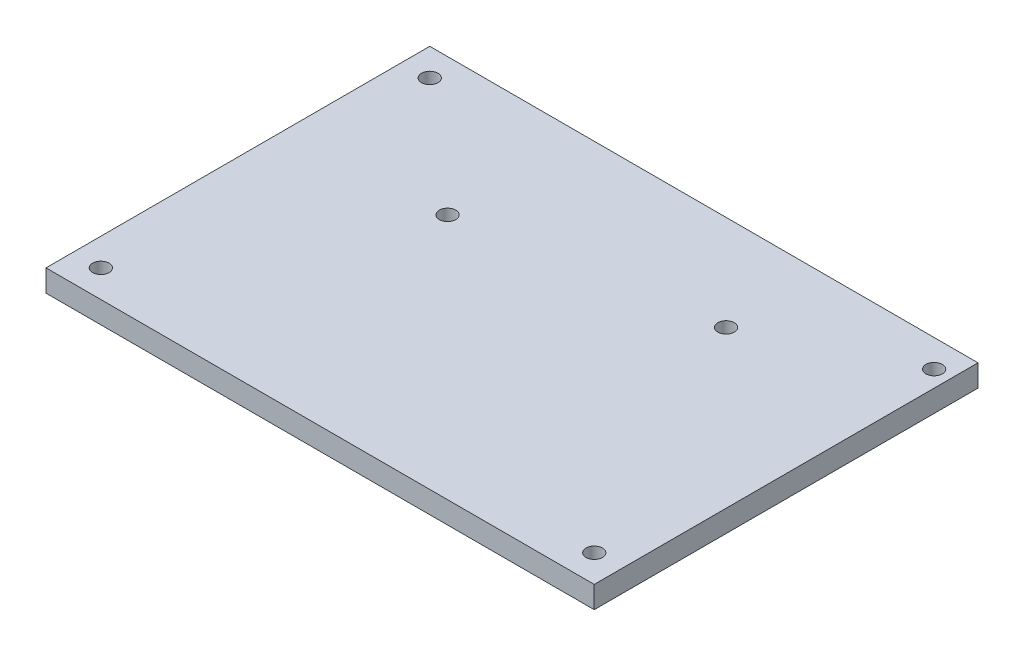
ISO-10303-21;
HEADER;
FILE_DESCRIPTION(('STEP AP214'),'2;1');
FILE_NAME('part.step','',(''),(''),'','','');
FILE_SCHEMA(('AUTOMOTIVE_DESIGN { 1 0 10303 214 1 1 1 1 }'));
ENDSEC;
DATA;
#1=APPLICATION_CONTEXT('core data for automotive mechanical design processes');
#2=APPLICATION_PROTOCOL_DEFINITION('international standard','automotive_design',2000,#1);
#3=PRODUCT_CONTEXT('',#1,'mechanical');
#4=PRODUCT('Part','Part','',(#3));
#5=PRODUCT_RELATED_PRODUCT_CATEGORY('part','',(#4));
#6=PRODUCT_DEFINITION_FORMATION('','',#4);
#7=PRODUCT_DEFINITION_CONTEXT('part definition',#1,'design');
#8=PRODUCT_DEFINITION('design','',#6,#7);
#9=PRODUCT_DEFINITION_SHAPE('','',#8);
#10=(LENGTH_UNIT() NAMED_UNIT(*) SI_UNIT(.MILLI.,.METRE.));
#11=(NAMED_UNIT(*) PLANE_ANGLE_UNIT() SI_UNIT($,.RADIAN.));
#12=(NAMED_UNIT(*) SI_UNIT($,.STERADIAN.) SOLID_ANGLE_UNIT());
#13=UNCERTAINTY_MEASURE_WITH_UNIT(LENGTH_MEASURE(1.E-05),#10,'distance_accuracy_value','');
#14=(GEOMETRIC_REPRESENTATION_CONTEXT(3) GLOBAL_UNCERTAINTY_ASSIGNED_CONTEXT((#13)) GLOBAL_UNIT_ASSIGNED_CONTEXT((#10,
#11,#12)) REPRESENTATION_CONTEXT('',''));
#15=CARTESIAN_POINT('',(0.,0.,0.));
#16=DIRECTION('',(0.,0.,1.));
#17=DIRECTION('',(1.,0.,0.));
#18=AXIS2_PLACEMENT_3D('',#15,#16,#17);
#19=CARTESIAN_POINT('',(0.,4.,0.));
#20=DIRECTION('',(1.,0.,0.));
#21=DIRECTION('',(0.,0.,-1.));
#22=AXIS2_PLACEMENT_3D('',#19,#20,#21);
#23=PLANE('',#22);
#24=DIRECTION('',(0.,0.,1.));
#25=VECTOR('',#24,1.);
#26=CARTESIAN_POINT('',(0.,0.,0.));
#27=LINE('',#26,#25);
#28=CARTESIAN_POINT('',(0.,0.,0.));
#29=VERTEX_POINT('',#28);
#30=CARTESIAN_POINT('',(0.,0.,70.));
#31=VERTEX_POINT('',#30);
#32=EDGE_CURVE('E98',#29,#31,#27,.T.);
#33=ORIENTED_EDGE('',*,*,#32,.T.);
#34=DIRECTION('',(0.,-1.,0.));
#35=VECTOR('',#34,1.);
#36=CARTESIAN_POINT('',(0.,4.,70.));
#37=LINE('',#36,#35);
#38=CARTESIAN_POINT('',(0.,4.,70.));
#39=VERTEX_POINT('',#38);
#40=EDGE_CURVE('E11',#39,#31,#37,.T.);
#41=ORIENTED_EDGE('',*,*,#40,.F.);
#42=DIRECTION('',(0.,0.,1.));
#43=VECTOR('',#42,1.);
#44=CARTESIAN_POINT('',(0.,4.,0.));
#45=LINE('',#44,#43);
#46=CARTESIAN_POINT('',(0.,4.,0.));
#47=VERTEX_POINT('',#46);
#48=EDGE_CURVE('E86',#47,#39,#45,.T.);
#49=ORIENTED_EDGE('',*,*,#48,.F.);
#50=DIRECTION('',(0.,-1.,0.));
#51=VECTOR('',#50,1.);
#52=CARTESIAN_POINT('',(0.,4.,0.));
#53=LINE('',#52,#51);
#54=EDGE_CURVE('E94',#47,#29,#53,.T.);
#55=ORIENTED_EDGE('',*,*,#54,.T.);
#56=EDGE_LOOP('',(#33,#41,#49,#55));
#57=FACE_BOUND('',#56,.T.);
#58=ADVANCED_FACE('F35',(#57),#23,.F.);
#59=CARTESIAN_POINT('',(0.,4.,70.));
#60=DIRECTION('',(0.,0.,-1.));
#61=DIRECTION('',(-1.,0.,0.));
#62=AXIS2_PLACEMENT_3D('',#59,#60,#61);
#63=PLANE('',#62);
#64=DIRECTION('',(1.,0.,0.));
#65=VECTOR('',#64,1.);
#66=CARTESIAN_POINT('',(0.,0.,70.));
#67=LINE('',#66,#65);
#68=CARTESIAN_POINT('',(100.,0.,70.));
#69=VERTEX_POINT('',#68);
#70=EDGE_CURVE('E90',#31,#69,#67,.T.);
#71=ORIENTED_EDGE('',*,*,#70,.T.);
#72=DIRECTION('',(0.,-1.,0.));
#73=VECTOR('',#72,1.);
#74=CARTESIAN_POINT('',(100.,4.,70.));
#75=LINE('',#74,#73);
#76=CARTESIAN_POINT('',(100.,4.,70.));
#77=VERTEX_POINT('',#76);
#78=EDGE_CURVE('E43',#77,#69,#75,.T.);
#79=ORIENTED_EDGE('',*,*,#78,.F.);
#80=DIRECTION('',(1.,0.,0.));
#81=VECTOR('',#80,1.);
#82=CARTESIAN_POINT('',(0.,4.,70.));
#83=LINE('',#82,#81);
#84=EDGE_CURVE('E81',#39,#77,#83,.T.);
#85=ORIENTED_EDGE('',*,*,#84,.F.);
#86=ORIENTED_EDGE('',*,*,#40,.T.);
#87=EDGE_LOOP('',(#71,#79,#85,#86));
#88=FACE_BOUND('',#87,.T.);
#89=ADVANCED_FACE('F89',(#88),#63,.F.);
#90=CARTESIAN_POINT('',(100.,4.,0.));
#91=DIRECTION('',(-1.,0.,0.));
#92=DIRECTION('',(0.,0.,1.));
#93=AXIS2_PLACEMENT_3D('',#90,#91,#92);
#94=PLANE('',#93);
#95=DIRECTION('',(0.,0.,-1.));
#96=VECTOR('',#95,1.);
#97=CARTESIAN_POINT('',(100.,0.,0.));
#98=LINE('',#97,#96);
#99=CARTESIAN_POINT('',(100.,0.,0.));
#100=VERTEX_POINT('',#99);
#101=EDGE_CURVE('E68',#69,#100,#98,.T.);
#102=ORIENTED_EDGE('',*,*,#101,.T.);
#103=DIRECTION('',(0.,-1.,0.));
#104=VECTOR('',#103,1.);
#105=CARTESIAN_POINT('',(100.,4.,0.));
#106=LINE('',#105,#104);
#107=CARTESIAN_POINT('',(100.,4.,0.));
#108=VERTEX_POINT('',#107);
#109=EDGE_CURVE('E91',#108,#100,#106,.T.);
#110=ORIENTED_EDGE('',*,*,#109,.F.);
#111=DIRECTION('',(0.,0.,-1.));
#112=VECTOR('',#111,1.);
#113=CARTESIAN_POINT('',(100.,4.,0.));
#114=LINE('',#113,#112);
#115=EDGE_CURVE('E84',#77,#108,#114,.T.);
#116=ORIENTED_EDGE('',*,*,#115,.F.);
#117=ORIENTED_EDGE('',*,*,#78,.T.);
#118=EDGE_LOOP('',(#102,#110,#116,#117));
#119=FACE_BOUND('',#118,.T.);
#120=ADVANCED_FACE('F92',(#119),#94,.F.);
#121=CARTESIAN_POINT('',(0.,4.,0.));
#122=DIRECTION('',(0.,0.,1.));
#123=DIRECTION('',(1.,0.,0.));
#124=AXIS2_PLACEMENT_3D('',#121,#122,#123);
#125=PLANE('',#124);
#126=DIRECTION('',(-1.,0.,0.));
#127=VECTOR('',#126,1.);
#128=CARTESIAN_POINT('',(0.,0.,0.));
#129=LINE('',#128,#127);
#130=EDGE_CURVE('E74',#100,#29,#129,.T.);
#131=ORIENTED_EDGE('',*,*,#130,.T.);
#132=ORIENTED_EDGE('',*,*,#54,.F.);
#133=DIRECTION('',(-1.,0.,0.));
#134=VECTOR('',#133,1.);
#135=CARTESIAN_POINT('',(0.,4.,0.));
#136=LINE('',#135,#134);
#137=EDGE_CURVE('E51',#108,#47,#136,.T.);
#138=ORIENTED_EDGE('',*,*,#137,.F.);
#139=ORIENTED_EDGE('',*,*,#109,.T.);
#140=EDGE_LOOP('',(#131,#132,#138,#139));
#141=FACE_BOUND('',#140,.T.);
#142=ADVANCED_FACE('F106',(#141),#125,.F.);
#143=CARTESIAN_POINT('',(0.,4.,0.));
#144=DIRECTION('',(0.,1.,0.));
#145=DIRECTION('',(0.,0.,1.));
#146=AXIS2_PLACEMENT_3D('',#143,#144,#145);
#147=PLANE('',#146);
#148=CARTESIAN_POINT('',(5.,4.,5.));
#149=DIRECTION('',(0.,1.,0.));
#150=DIRECTION('',(0.,0.,1.));
#151=AXIS2_PLACEMENT_3D('',#148,#149,#150);
#152=CIRCLE('',#151,1.5);
#153=CARTESIAN_POINT('',(5.,4.,6.5));
#154=VERTEX_POINT('',#153);
#155=EDGE_CURVE('E142',#154,#154,#152,.T.);
#156=ORIENTED_EDGE('',*,*,#155,.F.);
#157=EDGE_LOOP('',(#156));
#158=FACE_BOUND('',#157,.T.);
#159=CARTESIAN_POINT('',(97.,4.,5.));
#160=DIRECTION('',(0.,1.,0.));
#161=DIRECTION('',(0.,0.,1.));
#162=AXIS2_PLACEMENT_3D('',#159,#160,#161);
#163=CIRCLE('',#162,1.5);
#164=CARTESIAN_POINT('',(97.,4.,6.5));
#165=VERTEX_POINT('',#164);
#166=EDGE_CURVE('E136',#165,#165,#163,.T.);
#167=ORIENTED_EDGE('',*,*,#166,.F.);
#168=EDGE_LOOP('',(#167));
#169=FACE_BOUND('',#168,.T.);
#170=CARTESIAN_POINT('',(95.,4.,65.));
#171=DIRECTION('',(0.,1.,0.));
#172=DIRECTION('',(0.,0.,1.));
#173=AXIS2_PLACEMENT_3D('',#170,#171,#172);
#174=CIRCLE('',#173,1.5);
#175=CARTESIAN_POINT('',(95.,4.,66.5));
#176=VERTEX_POINT('',#175);
#177=EDGE_CURVE('E130',#176,#176,#174,.T.);
#178=ORIENTED_EDGE('',*,*,#177,.F.);
#179=EDGE_LOOP('',(#178));
#180=FACE_BOUND('',#179,.T.);
#181=CARTESIAN_POINT('',(5.,4.,65.));
#182=DIRECTION('',(0.,1.,0.));
#183=DIRECTION('',(0.,0.,1.));
#184=AXIS2_PLACEMENT_3D('',#181,#182,#183);
#185=CIRCLE('',#184,1.5);
#186=CARTESIAN_POINT('',(5.,4.,66.5));
#187=VERTEX_POINT('',#186);
#188=EDGE_CURVE('E124',#187,#187,#185,.T.);
#189=ORIENTED_EDGE('',*,*,#188,.F.);
#190=EDGE_LOOP('',(#189));
#191=FACE_BOUND('',#190,.T.);
#192=CARTESIAN_POINT('',(71.43,4.,17.38));
#193=DIRECTION('',(0.,1.,0.));
#194=DIRECTION('',(0.,0.,1.));
#195=AXIS2_PLACEMENT_3D('',#192,#193,#194);
#196=CIRCLE('',#195,1.5);
#197=CARTESIAN_POINT('',(71.43,4.,18.88));
#198=VERTEX_POINT('',#197);
#199=EDGE_CURVE('E118',#198,#198,#196,.T.);
#200=ORIENTED_EDGE('',*,*,#199,.F.);
#201=EDGE_LOOP('',(#200));
#202=FACE_BOUND('',#201,.T.);
#203=CARTESIAN_POINT('',(28.25,4.,25.));
#204=DIRECTION('',(0.,1.,0.));
#205=DIRECTION('',(0.,0.,1.));
#206=AXIS2_PLACEMENT_3D('',#203,#204,#205);
#207=CIRCLE('',#206,1.50000000000001);
#208=CARTESIAN_POINT('',(28.25,4.,26.5));
#209=VERTEX_POINT('',#208);
#210=EDGE_CURVE('E112',#209,#209,#207,.T.);
#211=ORIENTED_EDGE('',*,*,#210,.F.);
#212=EDGE_LOOP('',(#211));
#213=FACE_BOUND('',#212,.T.);
#214=ORIENTED_EDGE('',*,*,#48,.T.);
#215=ORIENTED_EDGE('',*,*,#84,.T.);
#216=ORIENTED_EDGE('',*,*,#115,.T.);
#217=ORIENTED_EDGE('',*,*,#137,.T.);
#218=EDGE_LOOP('',(#214,#215,#216,#217));
#219=FACE_BOUND('',#218,.T.);
#220=ADVANCED_FACE('F82',(#158,#169,#180,#191,#202,#213,#219),#147,.T.);
#221=CARTESIAN_POINT('',(0.,0.,0.));
#222=DIRECTION('',(0.,1.,0.));
#223=DIRECTION('',(0.,0.,1.));
#224=AXIS2_PLACEMENT_3D('',#221,#222,#223);
#225=PLANE('',#224);
#226=CARTESIAN_POINT('',(5.,0.,5.));
#227=DIRECTION('',(0.,1.,0.));
#228=DIRECTION('',(0.,0.,1.));
#229=AXIS2_PLACEMENT_3D('',#226,#227,#228);
#230=CIRCLE('',#229,1.5);
#231=CARTESIAN_POINT('',(5.,0.,6.5));
#232=VERTEX_POINT('',#231);
#233=EDGE_CURVE('E139',#232,#232,#230,.T.);
#234=ORIENTED_EDGE('',*,*,#233,.T.);
#235=EDGE_LOOP('',(#234));
#236=FACE_BOUND('',#235,.T.);
#237=CARTESIAN_POINT('',(97.,0.,5.));
#238=DIRECTION('',(0.,1.,0.));
#239=DIRECTION('',(0.,0.,1.));
#240=AXIS2_PLACEMENT_3D('',#237,#238,#239);
#241=CIRCLE('',#240,1.5);
#242=CARTESIAN_POINT('',(97.,0.,6.5));
#243=VERTEX_POINT('',#242);
#244=EDGE_CURVE('E133',#243,#243,#241,.T.);
#245=ORIENTED_EDGE('',*,*,#244,.T.);
#246=EDGE_LOOP('',(#245));
#247=FACE_BOUND('',#246,.T.);
#248=CARTESIAN_POINT('',(95.,0.,65.));
#249=DIRECTION('',(0.,1.,0.));
#250=DIRECTION('',(0.,0.,1.));
#251=AXIS2_PLACEMENT_3D('',#248,#249,#250);
#252=CIRCLE('',#251,1.5);
#253=CARTESIAN_POINT('',(95.,0.,66.5));
#254=VERTEX_POINT('',#253);
#255=EDGE_CURVE('E127',#254,#254,#252,.T.);
#256=ORIENTED_EDGE('',*,*,#255,.T.);
#257=EDGE_LOOP('',(#256));
#258=FACE_BOUND('',#257,.T.);
#259=CARTESIAN_POINT('',(5.,0.,65.));
#260=DIRECTION('',(0.,1.,0.));
#261=DIRECTION('',(0.,0.,1.));
#262=AXIS2_PLACEMENT_3D('',#259,#260,#261);
#263=CIRCLE('',#262,1.5);
#264=CARTESIAN_POINT('',(5.,0.,66.5));
#265=VERTEX_POINT('',#264);
#266=EDGE_CURVE('E121',#265,#265,#263,.T.);
#267=ORIENTED_EDGE('',*,*,#266,.T.);
#268=EDGE_LOOP('',(#267));
#269=FACE_BOUND('',#268,.T.);
#270=CARTESIAN_POINT('',(71.43,0.,17.38));
#271=DIRECTION('',(0.,1.,0.));
#272=DIRECTION('',(0.,0.,1.));
#273=AXIS2_PLACEMENT_3D('',#270,#271,#272);
#274=CIRCLE('',#273,1.5);
#275=CARTESIAN_POINT('',(71.43,0.,18.88));
#276=VERTEX_POINT('',#275);
#277=EDGE_CURVE('E115',#276,#276,#274,.T.);
#278=ORIENTED_EDGE('',*,*,#277,.T.);
#279=EDGE_LOOP('',(#278));
#280=FACE_BOUND('',#279,.T.);
#281=CARTESIAN_POINT('',(28.25,0.,25.));
#282=DIRECTION('',(0.,1.,0.));
#283=DIRECTION('',(0.,0.,1.));
#284=AXIS2_PLACEMENT_3D('',#281,#282,#283);
#285=CIRCLE('',#284,1.50000000000001);
#286=CARTESIAN_POINT('',(28.25,0.,26.5));
#287=VERTEX_POINT('',#286);
#288=EDGE_CURVE('E101',#287,#287,#285,.T.);
#289=ORIENTED_EDGE('',*,*,#288,.T.);
#290=EDGE_LOOP('',(#289));
#291=FACE_BOUND('',#290,.T.);
#292=ORIENTED_EDGE('',*,*,#32,.F.);
#293=ORIENTED_EDGE('',*,*,#130,.F.);
#294=ORIENTED_EDGE('',*,*,#101,.F.);
#295=ORIENTED_EDGE('',*,*,#70,.F.);
#296=EDGE_LOOP('',(#292,#293,#294,#295));
#297=FACE_BOUND('',#296,.T.);
#298=ADVANCED_FACE('F109',(#236,#247,#258,#269,#280,#291,#297),#225,.F.);
#299=CARTESIAN_POINT('',(28.25,0.,25.));
#300=DIRECTION('',(0.,1.,0.));
#301=DIRECTION('',(0.,0.,1.));
#302=AXIS2_PLACEMENT_3D('',#299,#300,#301);
#303=CYLINDRICAL_SURFACE('',#302,1.50000000000001);
#304=ORIENTED_EDGE('',*,*,#288,.F.);
#305=EDGE_LOOP('',(#304));
#306=FACE_BOUND('',#305,.T.);
#307=ORIENTED_EDGE('',*,*,#210,.T.);
#308=EDGE_LOOP('',(#307));
#309=FACE_BOUND('',#308,.T.);
#310=ADVANCED_FACE('F170',(#306,#309),#303,.F.);
#311=CARTESIAN_POINT('',(71.43,0.,17.38));
#312=DIRECTION('',(0.,1.,0.));
#313=DIRECTION('',(0.,0.,1.));
#314=AXIS2_PLACEMENT_3D('',#311,#312,#313);
#315=CYLINDRICAL_SURFACE('',#314,1.5);
#316=ORIENTED_EDGE('',*,*,#277,.F.);
#317=EDGE_LOOP('',(#316));
#318=FACE_BOUND('',#317,.T.);
#319=ORIENTED_EDGE('',*,*,#199,.T.);
#320=EDGE_LOOP('',(#319));
#321=FACE_BOUND('',#320,.T.);
#322=ADVANCED_FACE('F172',(#318,#321),#315,.F.);
#323=CARTESIAN_POINT('',(5.,0.,65.));
#324=DIRECTION('',(0.,1.,0.));
#325=DIRECTION('',(0.,0.,1.));
#326=AXIS2_PLACEMENT_3D('',#323,#324,#325);
#327=CYLINDRICAL_SURFACE('',#326,1.5);
#328=ORIENTED_EDGE('',*,*,#266,.F.);
#329=EDGE_LOOP('',(#328));
#330=FACE_BOUND('',#329,.T.);
#331=ORIENTED_EDGE('',*,*,#188,.T.);
#332=EDGE_LOOP('',(#331));
#333=FACE_BOUND('',#332,.T.);
#334=ADVANCED_FACE('F179',(#330,#333),#327,.F.);
#335=CARTESIAN_POINT('',(95.,0.,65.));
#336=DIRECTION('',(0.,1.,0.));
#337=DIRECTION('',(0.,0.,1.));
#338=AXIS2_PLACEMENT_3D('',#335,#336,#337);
#339=CYLINDRICAL_SURFACE('',#338,1.5);
#340=ORIENTED_EDGE('',*,*,#255,.F.);
#341=EDGE_LOOP('',(#340));
#342=FACE_BOUND('',#341,.T.);
#343=ORIENTED_EDGE('',*,*,#177,.T.);
#344=EDGE_LOOP('',(#343));
#345=FACE_BOUND('',#344,.T.);
#346=ADVANCED_FACE('F225',(#342,#345),#339,.F.);
#347=CARTESIAN_POINT('',(97.,0.,5.));
#348=DIRECTION('',(0.,1.,0.));
#349=DIRECTION('',(0.,0.,1.));
#350=AXIS2_PLACEMENT_3D('',#347,#348,#349);
#351=CYLINDRICAL_SURFACE('',#350,1.5);
#352=ORIENTED_EDGE('',*,*,#244,.F.);
#353=EDGE_LOOP('',(#352));
#354=FACE_BOUND('',#353,.T.);
#355=ORIENTED_EDGE('',*,*,#166,.T.);
#356=EDGE_LOOP('',(#355));
#357=FACE_BOUND('',#356,.T.);
#358=ADVANCED_FACE('F153',(#354,#357),#351,.F.);
#359=CARTESIAN_POINT('',(5.,0.,5.));
#360=DIRECTION('',(0.,1.,0.));
#361=DIRECTION('',(0.,0.,1.));
#362=AXIS2_PLACEMENT_3D('',#359,#360,#361);
#363=CYLINDRICAL_SURFACE('',#362,1.5);
#364=ORIENTED_EDGE('',*,*,#233,.F.);
#365=EDGE_LOOP('',(#364));
#366=FACE_BOUND('',#365,.T.);
#367=ORIENTED_EDGE('',*,*,#155,.T.);
#368=EDGE_LOOP('',(#367));
#369=FACE_BOUND('',#368,.T.);
#370=ADVANCED_FACE('F150',(#366,#369),#363,.F.);
#371=CLOSED_SHELL('',(#58,#89,#120,#142,#220,#298,#310,#322,#334,#346,#358,#370));
#372=MANIFOLD_SOLID_BREP('B2',#371);
#373=ADVANCED_BREP_SHAPE_REPRESENTATION('',(#18,#372),#14);
#374=SHAPE_DEFINITION_REPRESENTATION(#9,#373);
ENDSEC;
END-ISO-10303-21;
